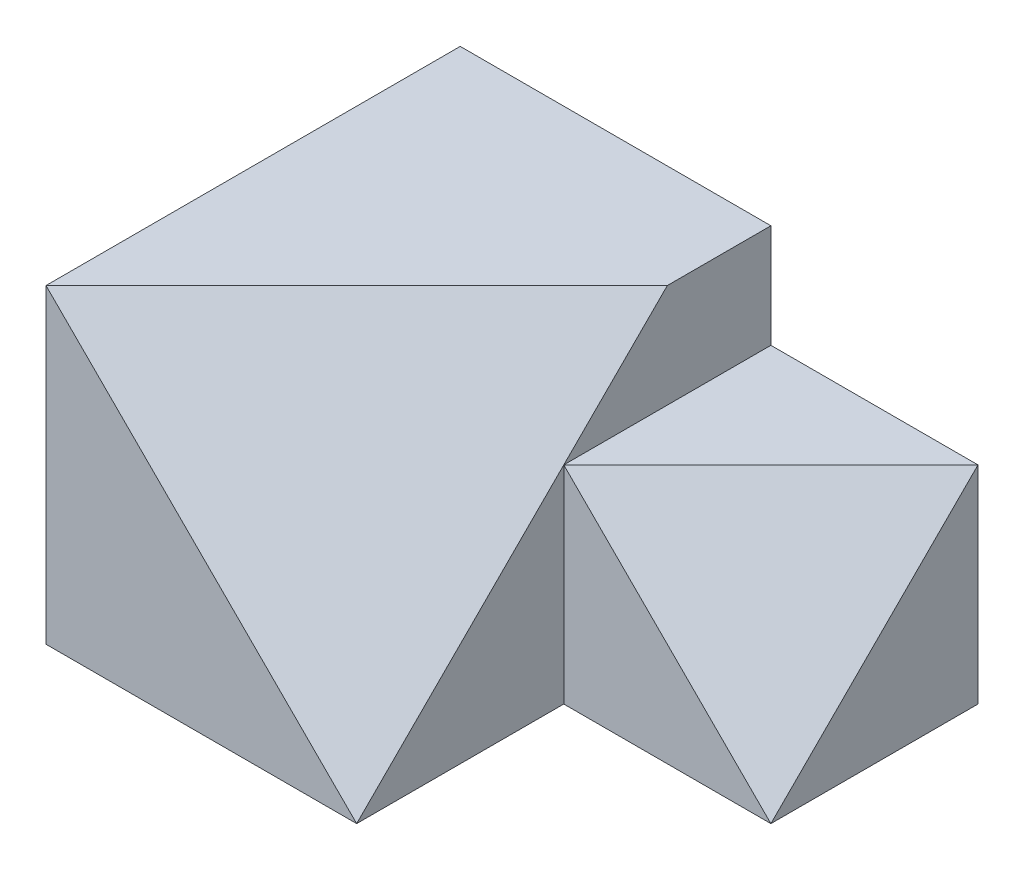
ISO-10303-21;
HEADER;
FILE_DESCRIPTION(('STEP AP214'),'2;1');
FILE_NAME('part.step','',(''),(''),'','','');
FILE_SCHEMA(('AUTOMOTIVE_DESIGN { 1 0 10303 214 1 1 1 1 }'));
ENDSEC;
DATA;
#1=APPLICATION_CONTEXT('core data for automotive mechanical design processes');
#2=APPLICATION_PROTOCOL_DEFINITION('international standard','automotive_design',2000,#1);
#3=PRODUCT_CONTEXT('',#1,'mechanical');
#4=PRODUCT('Part','Part','',(#3));
#5=PRODUCT_RELATED_PRODUCT_CATEGORY('part','',(#4));
#6=PRODUCT_DEFINITION_FORMATION('','',#4);
#7=PRODUCT_DEFINITION_CONTEXT('part definition',#1,'design');
#8=PRODUCT_DEFINITION('design','',#6,#7);
#9=PRODUCT_DEFINITION_SHAPE('','',#8);
#10=(LENGTH_UNIT() NAMED_UNIT(*) SI_UNIT(.MILLI.,.METRE.));
#11=(NAMED_UNIT(*) PLANE_ANGLE_UNIT() SI_UNIT($,.RADIAN.));
#12=(NAMED_UNIT(*) SI_UNIT($,.STERADIAN.) SOLID_ANGLE_UNIT());
#13=UNCERTAINTY_MEASURE_WITH_UNIT(LENGTH_MEASURE(1.E-05),#10,'distance_accuracy_value','');
#14=(GEOMETRIC_REPRESENTATION_CONTEXT(3) GLOBAL_UNCERTAINTY_ASSIGNED_CONTEXT((#13)) GLOBAL_UNIT_ASSIGNED_CONTEXT((#10,
#11,#12)) REPRESENTATION_CONTEXT('',''));
#15=CARTESIAN_POINT('',(0.,0.,0.));
#16=DIRECTION('',(0.,0.,1.));
#17=DIRECTION('',(1.,0.,0.));
#18=AXIS2_PLACEMENT_3D('',#15,#16,#17);
#19=CARTESIAN_POINT('',(0.,0.,1016.));
#20=DIRECTION('',(-1.,0.,0.));
#21=DIRECTION('',(0.,-1.,0.));
#22=AXIS2_PLACEMENT_3D('',#19,#20,#21);
#23=PLANE('',#22);
#24=DIRECTION('',(0.,0.707106781186547,-0.707106781186548));
#25=VECTOR('',#24,1.);
#26=CARTESIAN_POINT('',(0.,4.80740671595891E-13,1016.));
#27=LINE('',#26,#25);
#28=CARTESIAN_POINT('',(0.,9.61481341969824E-13,1016.));
#29=VERTEX_POINT('',#28);
#30=CARTESIAN_POINT('',(0.,508.,508.));
#31=VERTEX_POINT('',#30);
#32=EDGE_CURVE('E129',#29,#31,#27,.T.);
#33=ORIENTED_EDGE('',*,*,#32,.F.);
#34=DIRECTION('',(0.,0.,-1.));
#35=VECTOR('',#34,1.);
#36=CARTESIAN_POINT('',(0.,0.,1016.));
#37=LINE('',#36,#35);
#38=CARTESIAN_POINT('',(0.,0.,508.));
#39=VERTEX_POINT('',#38);
#40=EDGE_CURVE('E87',#29,#39,#37,.T.);
#41=ORIENTED_EDGE('',*,*,#40,.T.);
#42=DIRECTION('',(0.,1.,0.));
#43=VECTOR('',#42,1.);
#44=CARTESIAN_POINT('',(0.,0.,508.));
#45=LINE('',#44,#43);
#46=EDGE_CURVE('E125',#39,#31,#45,.T.);
#47=ORIENTED_EDGE('',*,*,#46,.T.);
#48=EDGE_LOOP('',(#33,#41,#47));
#49=FACE_BOUND('',#48,.T.);
#50=ADVANCED_FACE('F36',(#49),#23,.F.);
#51=CARTESIAN_POINT('',(0.,762.,254.));
#52=VERTEX_POINT('',#51);
#53=EDGE_CURVE('E134',#31,#52,#27,.T.);
#54=ORIENTED_EDGE('',*,*,#53,.F.);
#55=DIRECTION('',(0.,0.,-1.));
#56=VECTOR('',#55,1.);
#57=CARTESIAN_POINT('',(0.,508.,508.));
#58=LINE('',#57,#56);
#59=CARTESIAN_POINT('',(0.,508.,0.));
#60=VERTEX_POINT('',#59);
#61=EDGE_CURVE('E93',#31,#60,#58,.T.);
#62=ORIENTED_EDGE('',*,*,#61,.T.);
#63=DIRECTION('',(0.,1.,0.));
#64=VECTOR('',#63,1.);
#65=CARTESIAN_POINT('',(0.,0.,0.));
#66=LINE('',#65,#64);
#67=CARTESIAN_POINT('',(0.,762.,0.));
#68=VERTEX_POINT('',#67);
#69=EDGE_CURVE('E91',#60,#68,#66,.T.);
#70=ORIENTED_EDGE('',*,*,#69,.T.);
#71=DIRECTION('',(0.,0.,-1.));
#72=VECTOR('',#71,1.);
#73=CARTESIAN_POINT('',(0.,762.,1016.));
#74=LINE('',#73,#72);
#75=EDGE_CURVE('E75',#52,#68,#74,.T.);
#76=ORIENTED_EDGE('',*,*,#75,.F.);
#77=EDGE_LOOP('',(#54,#62,#70,#76));
#78=FACE_BOUND('',#77,.T.);
#79=ADVANCED_FACE('F92',(#78),#23,.F.);
#80=CARTESIAN_POINT('',(-2.22044604925031E-13,762.,1016.));
#81=DIRECTION('',(0.,-1.,0.));
#82=DIRECTION('',(1.,0.,0.));
#83=AXIS2_PLACEMENT_3D('',#80,#81,#82);
#84=PLANE('',#83);
#85=DIRECTION('',(-0.707106781186547,0.,0.707106781186548));
#86=VECTOR('',#85,1.);
#87=CARTESIAN_POINT('',(-381.,762.,635.));
#88=LINE('',#87,#86);
#89=CARTESIAN_POINT('',(-761.999999999999,762.,1016.));
#90=VERTEX_POINT('',#89);
#91=EDGE_CURVE('E84',#52,#90,#88,.T.);
#92=ORIENTED_EDGE('',*,*,#91,.F.);
#93=ORIENTED_EDGE('',*,*,#75,.T.);
#94=DIRECTION('',(-1.,0.,0.));
#95=VECTOR('',#94,1.);
#96=CARTESIAN_POINT('',(-2.22044604925031E-13,762.,0.));
#97=LINE('',#96,#95);
#98=CARTESIAN_POINT('',(-762.,762.,0.));
#99=VERTEX_POINT('',#98);
#100=EDGE_CURVE('E80',#68,#99,#97,.T.);
#101=ORIENTED_EDGE('',*,*,#100,.T.);
#102=DIRECTION('',(0.,0.,-1.));
#103=VECTOR('',#102,1.);
#104=CARTESIAN_POINT('',(-762.,762.,1016.));
#105=LINE('',#104,#103);
#106=EDGE_CURVE('E88',#90,#99,#105,.T.);
#107=ORIENTED_EDGE('',*,*,#106,.F.);
#108=EDGE_LOOP('',(#92,#93,#101,#107));
#109=FACE_BOUND('',#108,.T.);
#110=ADVANCED_FACE('F77',(#109),#84,.F.);
#111=CARTESIAN_POINT('',(0.,0.,1016.));
#112=DIRECTION('',(0.,0.,1.));
#113=DIRECTION('',(1.,0.,0.));
#114=AXIS2_PLACEMENT_3D('',#111,#112,#113);
#115=PLANE('',#114);
#116=DIRECTION('',(-1.,0.,0.));
#117=VECTOR('',#116,1.);
#118=CARTESIAN_POINT('',(0.,0.,1016.));
#119=LINE('',#118,#117);
#120=CARTESIAN_POINT('',(-762.,0.,1016.));
#121=VERTEX_POINT('',#120);
#122=EDGE_CURVE('E102',#29,#121,#119,.T.);
#123=ORIENTED_EDGE('',*,*,#122,.F.);
#124=DIRECTION('',(-0.707106781186548,0.707106781186547,0.));
#125=VECTOR('',#124,1.);
#126=CARTESIAN_POINT('',(4.80740671595891E-13,4.80740671595891E-13,1016.));
#127=LINE('',#126,#125);
#128=EDGE_CURVE('E138',#29,#90,#127,.T.);
#129=ORIENTED_EDGE('',*,*,#128,.T.);
#130=DIRECTION('',(0.,1.,0.));
#131=VECTOR('',#130,1.);
#132=CARTESIAN_POINT('',(-762.,0.,1016.));
#133=LINE('',#132,#131);
#134=EDGE_CURVE('E100',#121,#90,#133,.T.);
#135=ORIENTED_EDGE('',*,*,#134,.F.);
#136=EDGE_LOOP('',(#123,#129,#135));
#137=FACE_BOUND('',#136,.T.);
#138=ADVANCED_FACE('F172',(#137),#115,.T.);
#139=CARTESIAN_POINT('',(508.,0.,508.));
#140=DIRECTION('',(-1.,0.,0.));
#141=DIRECTION('',(0.,0.,1.));
#142=AXIS2_PLACEMENT_3D('',#139,#140,#141);
#143=PLANE('',#142);
#144=DIRECTION('',(0.,0.707106781186547,-0.707106781186548));
#145=VECTOR('',#144,1.);
#146=CARTESIAN_POINT('',(508.,3.24499953327227E-13,508.));
#147=LINE('',#146,#145);
#148=CARTESIAN_POINT('',(508.,6.66133814775094E-13,508.));
#149=VERTEX_POINT('',#148);
#150=CARTESIAN_POINT('',(508.,508.,1.11022302462516E-13));
#151=VERTEX_POINT('',#150);
#152=EDGE_CURVE('E141',#149,#151,#147,.T.);
#153=ORIENTED_EDGE('',*,*,#152,.F.);
#154=DIRECTION('',(0.,0.,-1.));
#155=VECTOR('',#154,1.);
#156=CARTESIAN_POINT('',(508.,0.,508.));
#157=LINE('',#156,#155);
#158=CARTESIAN_POINT('',(508.,0.,0.));
#159=VERTEX_POINT('',#158);
#160=EDGE_CURVE('E116',#149,#159,#157,.T.);
#161=ORIENTED_EDGE('',*,*,#160,.T.);
#162=DIRECTION('',(0.,1.,0.));
#163=VECTOR('',#162,1.);
#164=CARTESIAN_POINT('',(508.,0.,0.));
#165=LINE('',#164,#163);
#166=EDGE_CURVE('E119',#159,#151,#165,.T.);
#167=ORIENTED_EDGE('',*,*,#166,.T.);
#168=EDGE_LOOP('',(#153,#161,#167));
#169=FACE_BOUND('',#168,.T.);
#170=ADVANCED_FACE('F156',(#169),#143,.F.);
#171=CARTESIAN_POINT('',(0.,508.,508.));
#172=DIRECTION('',(0.,1.,0.));
#173=DIRECTION('',(0.,0.,1.));
#174=AXIS2_PLACEMENT_3D('',#171,#172,#173);
#175=PLANE('',#174);
#176=ORIENTED_EDGE('',*,*,#61,.F.);
#177=DIRECTION('',(0.707106781186547,0.,-0.707106781186548));
#178=VECTOR('',#177,1.);
#179=CARTESIAN_POINT('',(1.68259235058562E-13,508.,508.));
#180=LINE('',#179,#178);
#181=EDGE_CURVE('E144',#31,#151,#180,.T.);
#182=ORIENTED_EDGE('',*,*,#181,.T.);
#183=DIRECTION('',(1.,0.,0.));
#184=VECTOR('',#183,1.);
#185=CARTESIAN_POINT('',(0.,508.,0.));
#186=LINE('',#185,#184);
#187=EDGE_CURVE('E51',#60,#151,#186,.T.);
#188=ORIENTED_EDGE('',*,*,#187,.F.);
#189=EDGE_LOOP('',(#176,#182,#188));
#190=FACE_BOUND('',#189,.T.);
#191=ADVANCED_FACE('F147',(#190),#175,.T.);
#192=CARTESIAN_POINT('',(0.,0.,508.));
#193=DIRECTION('',(0.,0.,1.));
#194=DIRECTION('',(1.,0.,0.));
#195=AXIS2_PLACEMENT_3D('',#192,#193,#194);
#196=PLANE('',#195);
#197=DIRECTION('',(1.,0.,0.));
#198=VECTOR('',#197,1.);
#199=CARTESIAN_POINT('',(0.,0.,508.));
#200=LINE('',#199,#198);
#201=EDGE_CURVE('E127',#39,#149,#200,.T.);
#202=ORIENTED_EDGE('',*,*,#201,.T.);
#203=DIRECTION('',(-0.707106781186548,0.707106781186547,0.));
#204=VECTOR('',#203,1.);
#205=CARTESIAN_POINT('',(254.,254.,508.));
#206=LINE('',#205,#204);
#207=EDGE_CURVE('E12',#149,#31,#206,.T.);
#208=ORIENTED_EDGE('',*,*,#207,.T.);
#209=ORIENTED_EDGE('',*,*,#46,.F.);
#210=EDGE_LOOP('',(#202,#208,#209));
#211=FACE_BOUND('',#210,.T.);
#212=ADVANCED_FACE('F193',(#211),#196,.T.);
#213=CARTESIAN_POINT('',(-762.,0.,1016.));
#214=DIRECTION('',(-1.,0.,0.));
#215=DIRECTION('',(0.,0.,1.));
#216=AXIS2_PLACEMENT_3D('',#213,#214,#215);
#217=PLANE('',#216);
#218=DIRECTION('',(0.,1.,0.));
#219=VECTOR('',#218,1.);
#220=CARTESIAN_POINT('',(-762.,0.,0.));
#221=LINE('',#220,#219);
#222=CARTESIAN_POINT('',(-762.,0.,0.));
#223=VERTEX_POINT('',#222);
#224=EDGE_CURVE('E99',#223,#99,#221,.T.);
#225=ORIENTED_EDGE('',*,*,#224,.F.);
#226=DIRECTION('',(0.,0.,-1.));
#227=VECTOR('',#226,1.);
#228=CARTESIAN_POINT('',(-762.,0.,1016.));
#229=LINE('',#228,#227);
#230=EDGE_CURVE('E44',#121,#223,#229,.T.);
#231=ORIENTED_EDGE('',*,*,#230,.F.);
#232=ORIENTED_EDGE('',*,*,#134,.T.);
#233=ORIENTED_EDGE('',*,*,#106,.T.);
#234=EDGE_LOOP('',(#225,#231,#232,#233));
#235=FACE_BOUND('',#234,.T.);
#236=ADVANCED_FACE('F38',(#235),#217,.T.);
#237=CARTESIAN_POINT('',(0.,0.,1016.));
#238=DIRECTION('',(0.,-1.,0.));
#239=DIRECTION('',(1.,0.,0.));
#240=AXIS2_PLACEMENT_3D('',#237,#238,#239);
#241=PLANE('',#240);
#242=DIRECTION('',(-1.,0.,0.));
#243=VECTOR('',#242,1.);
#244=CARTESIAN_POINT('',(0.,0.,0.));
#245=LINE('',#244,#243);
#246=EDGE_CURVE('E95',#159,#223,#245,.T.);
#247=ORIENTED_EDGE('',*,*,#246,.F.);
#248=ORIENTED_EDGE('',*,*,#160,.F.);
#249=ORIENTED_EDGE('',*,*,#201,.F.);
#250=ORIENTED_EDGE('',*,*,#40,.F.);
#251=ORIENTED_EDGE('',*,*,#122,.T.);
#252=ORIENTED_EDGE('',*,*,#230,.T.);
#253=EDGE_LOOP('',(#247,#248,#249,#250,#251,#252));
#254=FACE_BOUND('',#253,.T.);
#255=ADVANCED_FACE('F111',(#254),#241,.T.);
#256=CARTESIAN_POINT('',(0.,0.,0.));
#257=DIRECTION('',(0.,0.,1.));
#258=DIRECTION('',(1.,0.,0.));
#259=AXIS2_PLACEMENT_3D('',#256,#257,#258);
#260=PLANE('',#259);
#261=ORIENTED_EDGE('',*,*,#224,.T.);
#262=ORIENTED_EDGE('',*,*,#100,.F.);
#263=ORIENTED_EDGE('',*,*,#69,.F.);
#264=ORIENTED_EDGE('',*,*,#187,.T.);
#265=ORIENTED_EDGE('',*,*,#166,.F.);
#266=ORIENTED_EDGE('',*,*,#246,.T.);
#267=EDGE_LOOP('',(#261,#262,#263,#264,#265,#266));
#268=FACE_BOUND('',#267,.T.);
#269=ADVANCED_FACE('F97',(#268),#260,.F.);
#270=CARTESIAN_POINT('',(338.666666666667,338.666666666667,338.666666666667));
#271=DIRECTION('',(0.577350269189626,0.577350269189626,0.577350269189626));
#272=DIRECTION('',(-0.707106781186548,0.707106781186547,0.));
#273=AXIS2_PLACEMENT_3D('',#270,#271,#272);
#274=PLANE('',#273);
#275=ORIENTED_EDGE('',*,*,#207,.F.);
#276=ORIENTED_EDGE('',*,*,#152,.T.);
#277=ORIENTED_EDGE('',*,*,#181,.F.);
#278=EDGE_LOOP('',(#275,#276,#277));
#279=FACE_BOUND('',#278,.T.);
#280=ADVANCED_FACE('F192',(#279),#274,.T.);
#281=ORIENTED_EDGE('',*,*,#128,.F.);
#282=ORIENTED_EDGE('',*,*,#32,.T.);
#283=ORIENTED_EDGE('',*,*,#53,.T.);
#284=ORIENTED_EDGE('',*,*,#91,.T.);
#285=EDGE_LOOP('',(#281,#282,#283,#284));
#286=FACE_BOUND('',#285,.T.);
#287=ADVANCED_FACE('F169',(#286),#274,.T.);
#288=CLOSED_SHELL('',(#50,#79,#110,#138,#170,#191,#212,#236,#255,#269,#280,#287));
#289=MANIFOLD_SOLID_BREP('B2',#288);
#290=ADVANCED_BREP_SHAPE_REPRESENTATION('',(#18,#289),#14);
#291=SHAPE_DEFINITION_REPRESENTATION(#9,#290);
ENDSEC;
END-ISO-10303-21;
